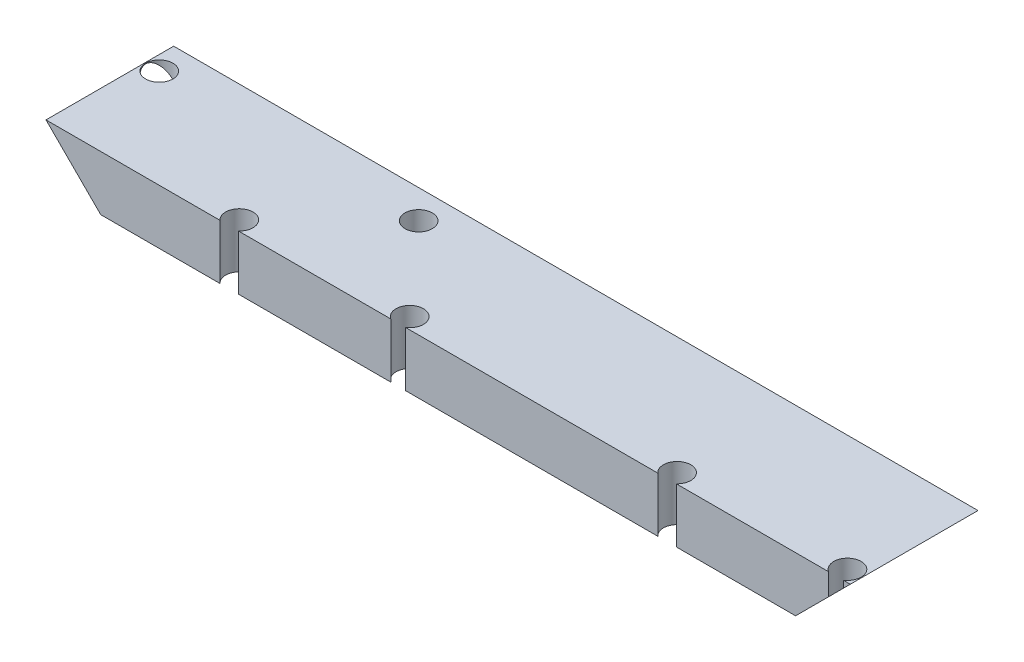
ISO-10303-21;
HEADER;
FILE_DESCRIPTION(('STEP AP214'),'2;1');
FILE_NAME('part.step','',(''),(''),'','','');
FILE_SCHEMA(('AUTOMOTIVE_DESIGN { 1 0 10303 214 1 1 1 1 }'));
ENDSEC;
DATA;
#1=APPLICATION_CONTEXT('core data for automotive mechanical design processes');
#2=APPLICATION_PROTOCOL_DEFINITION('international standard','automotive_design',2000,#1);
#3=PRODUCT_CONTEXT('',#1,'mechanical');
#4=PRODUCT('Part','Part','',(#3));
#5=PRODUCT_RELATED_PRODUCT_CATEGORY('part','',(#4));
#6=PRODUCT_DEFINITION_FORMATION('','',#4);
#7=PRODUCT_DEFINITION_CONTEXT('part definition',#1,'design');
#8=PRODUCT_DEFINITION('design','',#6,#7);
#9=PRODUCT_DEFINITION_SHAPE('','',#8);
#10=(LENGTH_UNIT() NAMED_UNIT(*) SI_UNIT(.MILLI.,.METRE.));
#11=(NAMED_UNIT(*) PLANE_ANGLE_UNIT() SI_UNIT($,.RADIAN.));
#12=(NAMED_UNIT(*) SI_UNIT($,.STERADIAN.) SOLID_ANGLE_UNIT());
#13=UNCERTAINTY_MEASURE_WITH_UNIT(LENGTH_MEASURE(1.E-05),#10,'distance_accuracy_value','');
#14=(GEOMETRIC_REPRESENTATION_CONTEXT(3) GLOBAL_UNCERTAINTY_ASSIGNED_CONTEXT((#13)) GLOBAL_UNIT_ASSIGNED_CONTEXT((#10,
#11,#12)) REPRESENTATION_CONTEXT('',''));
#15=CARTESIAN_POINT('',(0.,0.,0.));
#16=DIRECTION('',(0.,0.,1.));
#17=DIRECTION('',(1.,0.,0.));
#18=AXIS2_PLACEMENT_3D('',#15,#16,#17);
#19=CARTESIAN_POINT('',(0.,38.1,0.));
#20=DIRECTION('',(0.,0.,-1.));
#21=DIRECTION('',(-1.,0.,0.));
#22=AXIS2_PLACEMENT_3D('',#19,#20,#21);
#23=PLANE('',#22);
#24=DIRECTION('',(1.,0.,0.));
#25=VECTOR('',#24,1.);
#26=CARTESIAN_POINT('',(0.,0.,0.));
#27=LINE('',#26,#25);
#28=CARTESIAN_POINT('',(250.338601463434,0.,0.));
#29=VERTEX_POINT('',#28);
#30=CARTESIAN_POINT('',(425.940462477857,0.,0.));
#31=VERTEX_POINT('',#30);
#32=EDGE_CURVE('E157',#29,#31,#27,.T.);
#33=ORIENTED_EDGE('',*,*,#32,.T.);
#34=DIRECTION('',(0.,1.,0.));
#35=VECTOR('',#34,1.);
#36=CARTESIAN_POINT('',(425.940462477857,-0.001000000000001,0.));
#37=LINE('',#36,#35);
#38=CARTESIAN_POINT('',(425.940462477857,38.1,0.));
#39=VERTEX_POINT('',#38);
#40=EDGE_CURVE('E205',#39,#31,#37,.F.);
#41=ORIENTED_EDGE('',*,*,#40,.F.);
#42=DIRECTION('',(1.,0.,0.));
#43=VECTOR('',#42,1.);
#44=CARTESIAN_POINT('',(0.,38.1,0.));
#45=LINE('',#44,#43);
#46=CARTESIAN_POINT('',(250.338601463434,38.1,0.));
#47=VERTEX_POINT('',#46);
#48=EDGE_CURVE('E234',#47,#39,#45,.T.);
#49=ORIENTED_EDGE('',*,*,#48,.F.);
#50=DIRECTION('',(0.,1.,0.));
#51=VECTOR('',#50,1.);
#52=CARTESIAN_POINT('',(250.338601463434,-0.001000000000001,0.));
#53=LINE('',#52,#51);
#54=EDGE_CURVE('E191',#29,#47,#53,.T.);
#55=ORIENTED_EDGE('',*,*,#54,.F.);
#56=EDGE_LOOP('',(#33,#41,#49,#55));
#57=FACE_BOUND('',#56,.T.);
#58=ADVANCED_FACE('F31',(#57),#23,.F.);
#59=CARTESIAN_POINT('',(438.859537522146,0.,0.));
#60=VERTEX_POINT('',#59);
#61=CARTESIAN_POINT('',(521.9,0.,0.));
#62=VERTEX_POINT('',#61);
#63=EDGE_CURVE('E151',#60,#62,#27,.T.);
#64=ORIENTED_EDGE('',*,*,#63,.T.);
#65=DIRECTION('',(-0.707106781186548,-0.707106781186547,0.));
#66=VECTOR('',#65,1.);
#67=CARTESIAN_POINT('',(521.9,0.,0.));
#68=LINE('',#67,#66);
#69=CARTESIAN_POINT('',(544.861398536567,22.9613985365665,0.));
#70=VERTEX_POINT('',#69);
#71=EDGE_CURVE('E209',#70,#62,#68,.T.);
#72=ORIENTED_EDGE('',*,*,#71,.F.);
#73=DIRECTION('',(0.,1.,0.));
#74=VECTOR('',#73,1.);
#75=CARTESIAN_POINT('',(544.861398536567,-0.001000000000001,0.));
#76=LINE('',#75,#74);
#77=CARTESIAN_POINT('',(544.861398536567,38.1,0.));
#78=VERTEX_POINT('',#77);
#79=EDGE_CURVE('E196',#78,#70,#76,.F.);
#80=ORIENTED_EDGE('',*,*,#79,.F.);
#81=CARTESIAN_POINT('',(438.859537522146,38.1,0.));
#82=VERTEX_POINT('',#81);
#83=EDGE_CURVE('E148',#82,#78,#45,.T.);
#84=ORIENTED_EDGE('',*,*,#83,.F.);
#85=DIRECTION('',(0.,1.,0.));
#86=VECTOR('',#85,1.);
#87=CARTESIAN_POINT('',(438.859537522146,-0.001000000000001,0.));
#88=LINE('',#87,#86);
#89=EDGE_CURVE('E207',#60,#82,#88,.T.);
#90=ORIENTED_EDGE('',*,*,#89,.F.);
#91=EDGE_LOOP('',(#64,#72,#80,#84,#90));
#92=FACE_BOUND('',#91,.T.);
#93=ADVANCED_FACE('F242',(#92),#23,.F.);
#94=CARTESIAN_POINT('',(134.059537522143,0.,0.));
#95=VERTEX_POINT('',#94);
#96=CARTESIAN_POINT('',(240.061398536567,0.,0.));
#97=VERTEX_POINT('',#96);
#98=EDGE_CURVE('E150',#95,#97,#27,.T.);
#99=ORIENTED_EDGE('',*,*,#98,.T.);
#100=DIRECTION('',(0.,1.,0.));
#101=VECTOR('',#100,1.);
#102=CARTESIAN_POINT('',(240.061398536567,-0.001000000000001,0.));
#103=LINE('',#102,#101);
#104=CARTESIAN_POINT('',(240.061398536567,38.1,0.));
#105=VERTEX_POINT('',#104);
#106=EDGE_CURVE('E189',#105,#97,#103,.F.);
#107=ORIENTED_EDGE('',*,*,#106,.F.);
#108=CARTESIAN_POINT('',(134.059537522143,38.1,0.));
#109=VERTEX_POINT('',#108);
#110=EDGE_CURVE('E146',#109,#105,#45,.T.);
#111=ORIENTED_EDGE('',*,*,#110,.F.);
#112=DIRECTION('',(0.,1.,0.));
#113=VECTOR('',#112,1.);
#114=CARTESIAN_POINT('',(134.059537522143,-0.001000000000001,0.));
#115=LINE('',#114,#113);
#116=EDGE_CURVE('E174',#95,#109,#115,.T.);
#117=ORIENTED_EDGE('',*,*,#116,.F.);
#118=EDGE_LOOP('',(#99,#107,#111,#117));
#119=FACE_BOUND('',#118,.T.);
#120=ADVANCED_FACE('F232',(#119),#23,.F.);
#121=CARTESIAN_POINT('',(0.,38.1,0.));
#122=VERTEX_POINT('',#121);
#123=CARTESIAN_POINT('',(121.140462477858,38.1,0.));
#124=VERTEX_POINT('',#123);
#125=EDGE_CURVE('E144',#122,#124,#45,.T.);
#126=ORIENTED_EDGE('',*,*,#125,.F.);
#127=DIRECTION('',(-0.707106781186548,0.707106781186547,0.));
#128=VECTOR('',#127,1.);
#129=CARTESIAN_POINT('',(38.1,0.,0.));
#130=LINE('',#129,#128);
#131=CARTESIAN_POINT('',(38.1,0.,0.));
#132=VERTEX_POINT('',#131);
#133=EDGE_CURVE('E123',#132,#122,#130,.T.);
#134=ORIENTED_EDGE('',*,*,#133,.F.);
#135=CARTESIAN_POINT('',(121.140462477858,0.,0.));
#136=VERTEX_POINT('',#135);
#137=EDGE_CURVE('E149',#132,#136,#27,.T.);
#138=ORIENTED_EDGE('',*,*,#137,.T.);
#139=DIRECTION('',(0.,1.,0.));
#140=VECTOR('',#139,1.);
#141=CARTESIAN_POINT('',(121.140462477858,-0.001000000000001,0.));
#142=LINE('',#141,#140);
#143=EDGE_CURVE('E170',#124,#136,#142,.F.);
#144=ORIENTED_EDGE('',*,*,#143,.F.);
#145=EDGE_LOOP('',(#126,#134,#138,#144));
#146=FACE_BOUND('',#145,.T.);
#147=ADVANCED_FACE('F225',(#146),#23,.F.);
#148=DIRECTION('',(0.,1.,0.));
#149=VECTOR('',#148,1.);
#150=CARTESIAN_POINT('',(555.138601463434,-0.001000000000001,0.));
#151=LINE('',#150,#149);
#152=CARTESIAN_POINT('',(555.138601463434,33.2386014634335,0.));
#153=VERTEX_POINT('',#152);
#154=CARTESIAN_POINT('',(555.138601463434,38.1,0.));
#155=VERTEX_POINT('',#154);
#156=EDGE_CURVE('E199',#153,#155,#151,.T.);
#157=ORIENTED_EDGE('',*,*,#156,.F.);
#158=DIRECTION('',(-0.707106781186548,-0.707106781186547,0.));
#159=VECTOR('',#158,1.);
#160=CARTESIAN_POINT('',(521.9,0.,0.));
#161=LINE('',#160,#159);
#162=CARTESIAN_POINT('',(560.,38.1,0.));
#163=VERTEX_POINT('',#162);
#164=EDGE_CURVE('E56',#163,#153,#161,.T.);
#165=ORIENTED_EDGE('',*,*,#164,.F.);
#166=EDGE_CURVE('E127',#155,#163,#45,.T.);
#167=ORIENTED_EDGE('',*,*,#166,.F.);
#168=EDGE_LOOP('',(#157,#165,#167));
#169=FACE_BOUND('',#168,.T.);
#170=ADVANCED_FACE('F33',(#169),#23,.F.);
#171=CARTESIAN_POINT('',(0.,38.1,-88.9));
#172=DIRECTION('',(0.,0.,1.));
#173=DIRECTION('',(1.,0.,0.));
#174=AXIS2_PLACEMENT_3D('',#171,#172,#173);
#175=PLANE('',#174);
#176=DIRECTION('',(-1.,0.,0.));
#177=VECTOR('',#176,1.);
#178=CARTESIAN_POINT('',(0.,0.,-88.9));
#179=LINE('',#178,#177);
#180=CARTESIAN_POINT('',(521.9,0.,-88.9));
#181=VERTEX_POINT('',#180);
#182=CARTESIAN_POINT('',(38.1,0.,-88.9));
#183=VERTEX_POINT('',#182);
#184=EDGE_CURVE('E35',#181,#183,#179,.T.);
#185=ORIENTED_EDGE('',*,*,#184,.T.);
#186=DIRECTION('',(0.707106781186548,-0.707106781186547,0.));
#187=VECTOR('',#186,1.);
#188=CARTESIAN_POINT('',(38.1,0.,-88.9));
#189=LINE('',#188,#187);
#190=CARTESIAN_POINT('',(0.,38.1,-88.9));
#191=VERTEX_POINT('',#190);
#192=EDGE_CURVE('E48',#191,#183,#189,.T.);
#193=ORIENTED_EDGE('',*,*,#192,.F.);
#194=DIRECTION('',(-1.,0.,0.));
#195=VECTOR('',#194,1.);
#196=CARTESIAN_POINT('',(0.,38.1,-88.9));
#197=LINE('',#196,#195);
#198=CARTESIAN_POINT('',(560.,38.1,-88.9));
#199=VERTEX_POINT('',#198);
#200=EDGE_CURVE('E11',#199,#191,#197,.T.);
#201=ORIENTED_EDGE('',*,*,#200,.F.);
#202=DIRECTION('',(0.707106781186548,0.707106781186547,0.));
#203=VECTOR('',#202,1.);
#204=CARTESIAN_POINT('',(521.9,0.,-88.9));
#205=LINE('',#204,#203);
#206=EDGE_CURVE('E216',#181,#199,#205,.T.);
#207=ORIENTED_EDGE('',*,*,#206,.F.);
#208=EDGE_LOOP('',(#185,#193,#201,#207));
#209=FACE_BOUND('',#208,.T.);
#210=ADVANCED_FACE('F132',(#209),#175,.F.);
#211=CARTESIAN_POINT('',(0.,38.1,0.));
#212=DIRECTION('',(0.,1.,0.));
#213=DIRECTION('',(0.,0.,1.));
#214=AXIS2_PLACEMENT_3D('',#211,#212,#213);
#215=PLANE('',#214);
#216=CARTESIAN_POINT('',(432.400000000001,38.1,-7.00000000000059));
#217=DIRECTION('',(0.,1.,0.));
#218=DIRECTION('',(0.,0.,1.));
#219=AXIS2_PLACEMENT_3D('',#216,#217,#218);
#220=CIRCLE('',#219,9.52500000000002);
#221=EDGE_CURVE('E203',#82,#39,#220,.T.);
#222=ORIENTED_EDGE('',*,*,#221,.F.);
#223=ORIENTED_EDGE('',*,*,#83,.T.);
#224=CARTESIAN_POINT('',(550.,38.1,-8.02));
#225=DIRECTION('',(0.,1.,0.));
#226=DIRECTION('',(0.,0.,1.));
#227=AXIS2_PLACEMENT_3D('',#224,#225,#226);
#228=CIRCLE('',#227,9.52500000000002);
#229=EDGE_CURVE('E193',#155,#78,#228,.T.);
#230=ORIENTED_EDGE('',*,*,#229,.F.);
#231=ORIENTED_EDGE('',*,*,#166,.T.);
#232=DIRECTION('',(0.,0.,-1.));
#233=VECTOR('',#232,1.);
#234=CARTESIAN_POINT('',(560.,38.1,-88.9));
#235=LINE('',#234,#233);
#236=EDGE_CURVE('E40',#163,#199,#235,.T.);
#237=ORIENTED_EDGE('',*,*,#236,.T.);
#238=ORIENTED_EDGE('',*,*,#200,.T.);
#239=DIRECTION('',(0.,0.,1.));
#240=VECTOR('',#239,1.);
#241=CARTESIAN_POINT('',(0.,38.1,-88.9));
#242=LINE('',#241,#240);
#243=EDGE_CURVE('E120',#191,#122,#242,.T.);
#244=ORIENTED_EDGE('',*,*,#243,.T.);
#245=ORIENTED_EDGE('',*,*,#125,.T.);
#246=CARTESIAN_POINT('',(127.6,38.1,-7.00000000000214));
#247=DIRECTION('',(0.,1.,0.));
#248=DIRECTION('',(0.,0.,1.));
#249=AXIS2_PLACEMENT_3D('',#246,#247,#248);
#250=CIRCLE('',#249,9.525);
#251=EDGE_CURVE('E165',#109,#124,#250,.T.);
#252=ORIENTED_EDGE('',*,*,#251,.F.);
#253=ORIENTED_EDGE('',*,*,#110,.T.);
#254=CARTESIAN_POINT('',(245.2,38.1,-8.02));
#255=DIRECTION('',(0.,1.,0.));
#256=DIRECTION('',(0.,0.,1.));
#257=AXIS2_PLACEMENT_3D('',#254,#255,#256);
#258=CIRCLE('',#257,9.52499999999999);
#259=EDGE_CURVE('E187',#47,#105,#258,.T.);
#260=ORIENTED_EDGE('',*,*,#259,.F.);
#261=ORIENTED_EDGE('',*,*,#48,.T.);
#262=EDGE_LOOP('',(#222,#223,#230,#231,#237,#238,#244,#245,#252,#253,#260,#261));
#263=FACE_BOUND('',#262,.T.);
#264=CARTESIAN_POINT('',(10.0000000000002,38.1,-68.87));
#265=DIRECTION('',(0.,1.,0.));
#266=DIRECTION('',(0.,0.,1.));
#267=AXIS2_PLACEMENT_3D('',#264,#265,#266);
#268=CIRCLE('',#267,9.525);
#269=CARTESIAN_POINT('',(10.0000000000002,38.1,-59.345));
#270=VERTEX_POINT('',#269);
#271=EDGE_CURVE('E182',#270,#270,#268,.T.);
#272=ORIENTED_EDGE('',*,*,#271,.F.);
#273=EDGE_LOOP('',(#272));
#274=FACE_BOUND('',#273,.T.);
#275=CARTESIAN_POINT('',(190.57,38.1,-68.87));
#276=DIRECTION('',(0.,1.,0.));
#277=DIRECTION('',(0.,0.,1.));
#278=AXIS2_PLACEMENT_3D('',#275,#276,#277);
#279=CIRCLE('',#278,9.525);
#280=CARTESIAN_POINT('',(190.57,38.1,-59.345));
#281=VERTEX_POINT('',#280);
#282=EDGE_CURVE('E179',#281,#281,#279,.T.);
#283=ORIENTED_EDGE('',*,*,#282,.F.);
#284=EDGE_LOOP('',(#283));
#285=FACE_BOUND('',#284,.T.);
#286=ADVANCED_FACE('F139',(#263,#274,#285),#215,.T.);
#287=CARTESIAN_POINT('',(0.,0.,0.));
#288=DIRECTION('',(0.,1.,0.));
#289=DIRECTION('',(0.,0.,1.));
#290=AXIS2_PLACEMENT_3D('',#287,#288,#289);
#291=PLANE('',#290);
#292=CARTESIAN_POINT('',(190.57,0.,-68.87));
#293=DIRECTION('',(0.,1.,0.));
#294=DIRECTION('',(0.,0.,1.));
#295=AXIS2_PLACEMENT_3D('',#292,#293,#294);
#296=CIRCLE('',#295,9.525);
#297=CARTESIAN_POINT('',(190.57,0.,-59.345));
#298=VERTEX_POINT('',#297);
#299=EDGE_CURVE('E176',#298,#298,#296,.F.);
#300=ORIENTED_EDGE('',*,*,#299,.F.);
#301=EDGE_LOOP('',(#300));
#302=FACE_BOUND('',#301,.T.);
#303=ORIENTED_EDGE('',*,*,#137,.F.);
#304=DIRECTION('',(0.,0.,-1.));
#305=VECTOR('',#304,1.);
#306=CARTESIAN_POINT('',(38.1,0.,0.001000000000001));
#307=LINE('',#306,#305);
#308=EDGE_CURVE('E135',#132,#183,#307,.T.);
#309=ORIENTED_EDGE('',*,*,#308,.T.);
#310=ORIENTED_EDGE('',*,*,#184,.F.);
#311=DIRECTION('',(0.,0.,-1.));
#312=VECTOR('',#311,1.);
#313=CARTESIAN_POINT('',(521.9,0.,0.001000000000001));
#314=LINE('',#313,#312);
#315=EDGE_CURVE('E214',#62,#181,#314,.T.);
#316=ORIENTED_EDGE('',*,*,#315,.F.);
#317=ORIENTED_EDGE('',*,*,#63,.F.);
#318=CARTESIAN_POINT('',(432.400000000001,0.,-7.00000000000059));
#319=DIRECTION('',(0.,1.,0.));
#320=DIRECTION('',(0.,0.,1.));
#321=AXIS2_PLACEMENT_3D('',#318,#319,#320);
#322=CIRCLE('',#321,9.52500000000002);
#323=EDGE_CURVE('E201',#31,#60,#322,.F.);
#324=ORIENTED_EDGE('',*,*,#323,.F.);
#325=ORIENTED_EDGE('',*,*,#32,.F.);
#326=CARTESIAN_POINT('',(245.2,0.,-8.02));
#327=DIRECTION('',(0.,1.,0.));
#328=DIRECTION('',(0.,0.,1.));
#329=AXIS2_PLACEMENT_3D('',#326,#327,#328);
#330=CIRCLE('',#329,9.52499999999999);
#331=EDGE_CURVE('E185',#97,#29,#330,.F.);
#332=ORIENTED_EDGE('',*,*,#331,.F.);
#333=ORIENTED_EDGE('',*,*,#98,.F.);
#334=CARTESIAN_POINT('',(127.6,0.,-7.00000000000214));
#335=DIRECTION('',(0.,1.,0.));
#336=DIRECTION('',(0.,0.,1.));
#337=AXIS2_PLACEMENT_3D('',#334,#335,#336);
#338=CIRCLE('',#337,9.525);
#339=EDGE_CURVE('E159',#136,#95,#338,.F.);
#340=ORIENTED_EDGE('',*,*,#339,.F.);
#341=EDGE_LOOP('',(#303,#309,#310,#316,#317,#324,#325,#332,#333,#340));
#342=FACE_BOUND('',#341,.T.);
#343=ADVANCED_FACE('F223',(#302,#342),#291,.F.);
#344=CARTESIAN_POINT('',(127.6,-0.001000000000001,-7.00000000000214));
#345=DIRECTION('',(0.,1.,0.));
#346=DIRECTION('',(0.,0.,1.));
#347=AXIS2_PLACEMENT_3D('',#344,#345,#346);
#348=CYLINDRICAL_SURFACE('',#347,9.525);
#349=ORIENTED_EDGE('',*,*,#143,.T.);
#350=ORIENTED_EDGE('',*,*,#339,.T.);
#351=ORIENTED_EDGE('',*,*,#116,.T.);
#352=ORIENTED_EDGE('',*,*,#251,.T.);
#353=EDGE_LOOP('',(#349,#350,#351,#352));
#354=FACE_BOUND('',#353,.T.);
#355=ADVANCED_FACE('F321',(#354),#348,.F.);
#356=CARTESIAN_POINT('',(190.57,-0.001000000000001,-68.87));
#357=DIRECTION('',(0.,1.,0.));
#358=DIRECTION('',(0.,0.,1.));
#359=AXIS2_PLACEMENT_3D('',#356,#357,#358);
#360=CYLINDRICAL_SURFACE('',#359,9.525);
#361=ORIENTED_EDGE('',*,*,#282,.T.);
#362=EDGE_LOOP('',(#361));
#363=FACE_BOUND('',#362,.T.);
#364=ORIENTED_EDGE('',*,*,#299,.T.);
#365=EDGE_LOOP('',(#364));
#366=FACE_BOUND('',#365,.T.);
#367=ADVANCED_FACE('F262',(#363,#366),#360,.F.);
#368=CARTESIAN_POINT('',(10.0000000000002,-0.001000000000001,-68.87));
#369=DIRECTION('',(0.,1.,0.));
#370=DIRECTION('',(0.,0.,1.));
#371=AXIS2_PLACEMENT_3D('',#368,#369,#370);
#372=CYLINDRICAL_SURFACE('',#371,9.525);
#373=CARTESIAN_POINT('',(10.0000000000002,28.0999999999998,-68.87));
#374=DIRECTION('',(0.707106781186547,0.707106781186548,0.));
#375=DIRECTION('',(-0.707106781186548,0.707106781186547,0.));
#376=AXIS2_PLACEMENT_3D('',#373,#374,#375);
#377=ELLIPSE('',#376,13.4703841816037,9.525);
#378=CARTESIAN_POINT('',(0.475000000000229,37.6249999999998,-68.87));
#379=VERTEX_POINT('',#378);
#380=EDGE_CURVE('E218',#379,#379,#377,.T.);
#381=ORIENTED_EDGE('',*,*,#380,.F.);
#382=EDGE_LOOP('',(#381));
#383=FACE_BOUND('',#382,.T.);
#384=ORIENTED_EDGE('',*,*,#271,.T.);
#385=EDGE_LOOP('',(#384));
#386=FACE_BOUND('',#385,.T.);
#387=ADVANCED_FACE('F254',(#383,#386),#372,.F.);
#388=CARTESIAN_POINT('',(245.2,-0.001000000000001,-8.02));
#389=DIRECTION('',(0.,1.,0.));
#390=DIRECTION('',(0.,0.,1.));
#391=AXIS2_PLACEMENT_3D('',#388,#389,#390);
#392=CYLINDRICAL_SURFACE('',#391,9.52499999999999);
#393=ORIENTED_EDGE('',*,*,#106,.T.);
#394=ORIENTED_EDGE('',*,*,#331,.T.);
#395=ORIENTED_EDGE('',*,*,#54,.T.);
#396=ORIENTED_EDGE('',*,*,#259,.T.);
#397=EDGE_LOOP('',(#393,#394,#395,#396));
#398=FACE_BOUND('',#397,.T.);
#399=ADVANCED_FACE('F252',(#398),#392,.F.);
#400=CARTESIAN_POINT('',(550.,-0.001000000000001,-8.02));
#401=DIRECTION('',(0.,1.,0.));
#402=DIRECTION('',(0.,0.,1.));
#403=AXIS2_PLACEMENT_3D('',#400,#401,#402);
#404=CYLINDRICAL_SURFACE('',#403,9.52500000000002);
#405=ORIENTED_EDGE('',*,*,#79,.T.);
#406=CARTESIAN_POINT('',(550.,28.1,-8.02));
#407=DIRECTION('',(-0.707106781186547,0.707106781186548,0.));
#408=DIRECTION('',(0.707106781186548,0.707106781186547,0.));
#409=AXIS2_PLACEMENT_3D('',#406,#407,#408);
#410=ELLIPSE('',#409,13.4703841816038,9.52500000000002);
#411=EDGE_CURVE('E212',#153,#70,#410,.T.);
#412=ORIENTED_EDGE('',*,*,#411,.F.);
#413=ORIENTED_EDGE('',*,*,#156,.T.);
#414=ORIENTED_EDGE('',*,*,#229,.T.);
#415=EDGE_LOOP('',(#405,#412,#413,#414));
#416=FACE_BOUND('',#415,.T.);
#417=ADVANCED_FACE('F240',(#416),#404,.F.);
#418=CARTESIAN_POINT('',(432.400000000001,-0.001000000000001,-7.00000000000059));
#419=DIRECTION('',(0.,1.,0.));
#420=DIRECTION('',(0.,0.,1.));
#421=AXIS2_PLACEMENT_3D('',#418,#419,#420);
#422=CYLINDRICAL_SURFACE('',#421,9.52500000000002);
#423=ORIENTED_EDGE('',*,*,#40,.T.);
#424=ORIENTED_EDGE('',*,*,#323,.T.);
#425=ORIENTED_EDGE('',*,*,#89,.T.);
#426=ORIENTED_EDGE('',*,*,#221,.T.);
#427=EDGE_LOOP('',(#423,#424,#425,#426));
#428=FACE_BOUND('',#427,.T.);
#429=ADVANCED_FACE('F260',(#428),#422,.F.);
#430=CARTESIAN_POINT('',(521.9,0.,0.001000000000001));
#431=DIRECTION('',(-0.707106781186547,0.707106781186548,0.));
#432=DIRECTION('',(-0.707106781186548,-0.707106781186547,0.));
#433=AXIS2_PLACEMENT_3D('',#430,#431,#432);
#434=PLANE('',#433);
#435=ORIENTED_EDGE('',*,*,#71,.T.);
#436=ORIENTED_EDGE('',*,*,#315,.T.);
#437=ORIENTED_EDGE('',*,*,#206,.T.);
#438=ORIENTED_EDGE('',*,*,#236,.F.);
#439=ORIENTED_EDGE('',*,*,#164,.T.);
#440=ORIENTED_EDGE('',*,*,#411,.T.);
#441=EDGE_LOOP('',(#435,#436,#437,#438,#439,#440));
#442=FACE_BOUND('',#441,.T.);
#443=ADVANCED_FACE('F243',(#442),#434,.F.);
#444=CARTESIAN_POINT('',(38.1,0.,0.001000000000001));
#445=DIRECTION('',(0.707106781186547,0.707106781186548,0.));
#446=DIRECTION('',(-0.707106781186548,0.707106781186547,0.));
#447=AXIS2_PLACEMENT_3D('',#444,#445,#446);
#448=PLANE('',#447);
#449=ORIENTED_EDGE('',*,*,#380,.T.);
#450=EDGE_LOOP('',(#449));
#451=FACE_BOUND('',#450,.T.);
#452=ORIENTED_EDGE('',*,*,#133,.T.);
#453=ORIENTED_EDGE('',*,*,#243,.F.);
#454=ORIENTED_EDGE('',*,*,#192,.T.);
#455=ORIENTED_EDGE('',*,*,#308,.F.);
#456=EDGE_LOOP('',(#452,#453,#454,#455));
#457=FACE_BOUND('',#456,.T.);
#458=ADVANCED_FACE('F121',(#451,#457),#448,.F.);
#459=CLOSED_SHELL('',(#58,#93,#120,#147,#170,#210,#286,#343,#355,#367,#387,#399,#417,#429,#443,#458));
#460=MANIFOLD_SOLID_BREP('B2',#459);
#461=ADVANCED_BREP_SHAPE_REPRESENTATION('',(#18,#460),#14);
#462=SHAPE_DEFINITION_REPRESENTATION(#9,#461);
ENDSEC;
END-ISO-10303-21;
